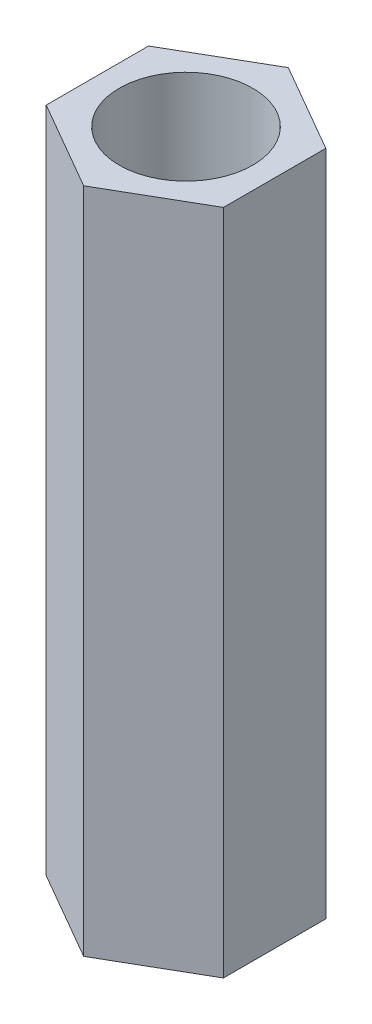
ISO-10303-21;
HEADER;
FILE_DESCRIPTION(('STEP AP214'),'2;1');
FILE_NAME('part.step','',(''),(''),'','','');
FILE_SCHEMA(('AUTOMOTIVE_DESIGN { 1 0 10303 214 1 1 1 1 }'));
ENDSEC;
DATA;
#1=APPLICATION_CONTEXT('core data for automotive mechanical design processes');
#2=APPLICATION_PROTOCOL_DEFINITION('international standard','automotive_design',2000,#1);
#3=PRODUCT_CONTEXT('',#1,'mechanical');
#4=PRODUCT('Part','Part','',(#3));
#5=PRODUCT_RELATED_PRODUCT_CATEGORY('part','',(#4));
#6=PRODUCT_DEFINITION_FORMATION('','',#4);
#7=PRODUCT_DEFINITION_CONTEXT('part definition',#1,'design');
#8=PRODUCT_DEFINITION('design','',#6,#7);
#9=PRODUCT_DEFINITION_SHAPE('','',#8);
#10=(LENGTH_UNIT() NAMED_UNIT(*) SI_UNIT(.MILLI.,.METRE.));
#11=(NAMED_UNIT(*) PLANE_ANGLE_UNIT() SI_UNIT($,.RADIAN.));
#12=(NAMED_UNIT(*) SI_UNIT($,.STERADIAN.) SOLID_ANGLE_UNIT());
#13=UNCERTAINTY_MEASURE_WITH_UNIT(LENGTH_MEASURE(1.E-05),#10,'distance_accuracy_value','');
#14=(GEOMETRIC_REPRESENTATION_CONTEXT(3) GLOBAL_UNCERTAINTY_ASSIGNED_CONTEXT((#13)) GLOBAL_UNIT_ASSIGNED_CONTEXT((#10,
#11,#12)) REPRESENTATION_CONTEXT('',''));
#15=CARTESIAN_POINT('',(0.,0.,0.));
#16=DIRECTION('',(0.,0.,1.));
#17=DIRECTION('',(1.,0.,0.));
#18=AXIS2_PLACEMENT_3D('',#15,#16,#17);
#19=CARTESIAN_POINT('',(0.,15.,0.));
#20=DIRECTION('',(0.,1.,0.));
#21=DIRECTION('',(0.,0.,1.));
#22=AXIS2_PLACEMENT_3D('',#19,#20,#21);
#23=PLANE('',#22);
#24=DIRECTION('',(0.,0.,-1.));
#25=VECTOR('',#24,1.);
#26=CARTESIAN_POINT('',(1.99185842870421,15.,1.14999999999999));
#27=LINE('',#26,#25);
#28=CARTESIAN_POINT('',(1.99185842870421,15.,1.14999999999999));
#29=VERTEX_POINT('',#28);
#30=CARTESIAN_POINT('',(1.9918584287042,15.,-1.15000000000001));
#31=VERTEX_POINT('',#30);
#32=EDGE_CURVE('E137',#29,#31,#27,.T.);
#33=ORIENTED_EDGE('',*,*,#32,.T.);
#34=DIRECTION('',(-0.866025403784441,0.,-0.499999999999995));
#35=VECTOR('',#34,1.);
#36=CARTESIAN_POINT('',(1.9918584287042,15.,-1.15000000000001));
#37=LINE('',#36,#35);
#38=CARTESIAN_POINT('',(0.,15.,-2.3));
#39=VERTEX_POINT('',#38);
#40=EDGE_CURVE('E95',#31,#39,#37,.T.);
#41=ORIENTED_EDGE('',*,*,#40,.T.);
#42=DIRECTION('',(-0.866025403784436,0.,0.500000000000004));
#43=VECTOR('',#42,1.);
#44=CARTESIAN_POINT('',(0.,15.,-2.3));
#45=LINE('',#44,#43);
#46=CARTESIAN_POINT('',(-1.99185842870422,15.,-1.14999999999999));
#47=VERTEX_POINT('',#46);
#48=EDGE_CURVE('E108',#39,#47,#45,.T.);
#49=ORIENTED_EDGE('',*,*,#48,.T.);
#50=DIRECTION('',(0.,0.,1.));
#51=VECTOR('',#50,1.);
#52=CARTESIAN_POINT('',(-1.99185842870422,15.,-1.14999999999999));
#53=LINE('',#52,#51);
#54=CARTESIAN_POINT('',(-1.9918584287042,15.,1.15000000000001));
#55=VERTEX_POINT('',#54);
#56=EDGE_CURVE('E102',#47,#55,#53,.T.);
#57=ORIENTED_EDGE('',*,*,#56,.T.);
#58=DIRECTION('',(0.866025403784441,0.,0.499999999999995));
#59=VECTOR('',#58,1.);
#60=CARTESIAN_POINT('',(-1.9918584287042,15.,1.15000000000001));
#61=LINE('',#60,#59);
#62=CARTESIAN_POINT('',(0.,15.,2.3));
#63=VERTEX_POINT('',#62);
#64=EDGE_CURVE('E106',#55,#63,#61,.T.);
#65=ORIENTED_EDGE('',*,*,#64,.T.);
#66=DIRECTION('',(0.866025403784436,0.,-0.500000000000004));
#67=VECTOR('',#66,1.);
#68=CARTESIAN_POINT('',(0.,15.,2.3));
#69=LINE('',#68,#67);
#70=EDGE_CURVE('E58',#63,#29,#69,.T.);
#71=ORIENTED_EDGE('',*,*,#70,.T.);
#72=EDGE_LOOP('',(#33,#41,#49,#57,#65,#71));
#73=FACE_BOUND('',#72,.T.);
#74=CARTESIAN_POINT('',(0.,15.,0.));
#75=DIRECTION('',(0.,1.,0.));
#76=DIRECTION('',(0.,0.,1.));
#77=AXIS2_PLACEMENT_3D('',#74,#75,#76);
#78=CIRCLE('',#77,1.5);
#79=CARTESIAN_POINT('',(0.,15.,1.5));
#80=VERTEX_POINT('',#79);
#81=EDGE_CURVE('E130',#80,#80,#78,.T.);
#82=ORIENTED_EDGE('',*,*,#81,.F.);
#83=EDGE_LOOP('',(#82));
#84=FACE_BOUND('',#83,.T.);
#85=ADVANCED_FACE('F41',(#73,#84),#23,.T.);
#86=CARTESIAN_POINT('',(0.,0.,0.));
#87=DIRECTION('',(0.,1.,0.));
#88=DIRECTION('',(0.,0.,1.));
#89=AXIS2_PLACEMENT_3D('',#86,#87,#88);
#90=PLANE('',#89);
#91=DIRECTION('',(0.,0.,-1.));
#92=VECTOR('',#91,1.);
#93=CARTESIAN_POINT('',(1.99185842870421,0.,1.14999999999999));
#94=LINE('',#93,#92);
#95=CARTESIAN_POINT('',(1.99185842870421,0.,1.14999999999999));
#96=VERTEX_POINT('',#95);
#97=CARTESIAN_POINT('',(1.9918584287042,0.,-1.15000000000001));
#98=VERTEX_POINT('',#97);
#99=EDGE_CURVE('E126',#96,#98,#94,.T.);
#100=ORIENTED_EDGE('',*,*,#99,.F.);
#101=DIRECTION('',(0.866025403784436,0.,-0.500000000000004));
#102=VECTOR('',#101,1.);
#103=CARTESIAN_POINT('',(0.,0.,2.3));
#104=LINE('',#103,#102);
#105=CARTESIAN_POINT('',(0.,0.,2.3));
#106=VERTEX_POINT('',#105);
#107=EDGE_CURVE('E87',#106,#96,#104,.T.);
#108=ORIENTED_EDGE('',*,*,#107,.F.);
#109=DIRECTION('',(0.866025403784441,0.,0.499999999999995));
#110=VECTOR('',#109,1.);
#111=CARTESIAN_POINT('',(-1.9918584287042,0.,1.15000000000001));
#112=LINE('',#111,#110);
#113=CARTESIAN_POINT('',(-1.9918584287042,0.,1.15000000000001));
#114=VERTEX_POINT('',#113);
#115=EDGE_CURVE('E81',#114,#106,#112,.T.);
#116=ORIENTED_EDGE('',*,*,#115,.F.);
#117=DIRECTION('',(0.,0.,1.));
#118=VECTOR('',#117,1.);
#119=CARTESIAN_POINT('',(-1.99185842870422,0.,-1.14999999999999));
#120=LINE('',#119,#118);
#121=CARTESIAN_POINT('',(-1.99185842870422,0.,-1.14999999999999));
#122=VERTEX_POINT('',#121);
#123=EDGE_CURVE('E116',#122,#114,#120,.T.);
#124=ORIENTED_EDGE('',*,*,#123,.F.);
#125=DIRECTION('',(-0.866025403784436,0.,0.500000000000004));
#126=VECTOR('',#125,1.);
#127=CARTESIAN_POINT('',(0.,0.,-2.3));
#128=LINE('',#127,#126);
#129=CARTESIAN_POINT('',(0.,0.,-2.3));
#130=VERTEX_POINT('',#129);
#131=EDGE_CURVE('E132',#130,#122,#128,.T.);
#132=ORIENTED_EDGE('',*,*,#131,.F.);
#133=DIRECTION('',(-0.866025403784441,0.,-0.499999999999995));
#134=VECTOR('',#133,1.);
#135=CARTESIAN_POINT('',(1.9918584287042,0.,-1.15000000000001));
#136=LINE('',#135,#134);
#137=EDGE_CURVE('E129',#98,#130,#136,.T.);
#138=ORIENTED_EDGE('',*,*,#137,.F.);
#139=EDGE_LOOP('',(#100,#108,#116,#124,#132,#138));
#140=FACE_BOUND('',#139,.T.);
#141=CARTESIAN_POINT('',(0.,0.,0.));
#142=DIRECTION('',(0.,1.,0.));
#143=DIRECTION('',(0.,0.,1.));
#144=AXIS2_PLACEMENT_3D('',#141,#142,#143);
#145=CIRCLE('',#144,1.5);
#146=CARTESIAN_POINT('',(0.,0.,1.5));
#147=VERTEX_POINT('',#146);
#148=EDGE_CURVE('E230',#147,#147,#145,.T.);
#149=ORIENTED_EDGE('',*,*,#148,.T.);
#150=EDGE_LOOP('',(#149));
#151=FACE_BOUND('',#150,.T.);
#152=ADVANCED_FACE('F146',(#140,#151),#90,.F.);
#153=CARTESIAN_POINT('',(1.99185842870421,15.,1.14999999999999));
#154=DIRECTION('',(-1.,0.,0.));
#155=DIRECTION('',(0.,0.,1.));
#156=AXIS2_PLACEMENT_3D('',#153,#154,#155);
#157=PLANE('',#156);
#158=ORIENTED_EDGE('',*,*,#99,.T.);
#159=DIRECTION('',(0.,-1.,0.));
#160=VECTOR('',#159,1.);
#161=CARTESIAN_POINT('',(1.9918584287042,15.,-1.15000000000001));
#162=LINE('',#161,#160);
#163=EDGE_CURVE('E11',#31,#98,#162,.T.);
#164=ORIENTED_EDGE('',*,*,#163,.F.);
#165=ORIENTED_EDGE('',*,*,#32,.F.);
#166=DIRECTION('',(0.,-1.,0.));
#167=VECTOR('',#166,1.);
#168=CARTESIAN_POINT('',(1.99185842870421,15.,1.14999999999999));
#169=LINE('',#168,#167);
#170=EDGE_CURVE('E122',#29,#96,#169,.T.);
#171=ORIENTED_EDGE('',*,*,#170,.T.);
#172=EDGE_LOOP('',(#158,#164,#165,#171));
#173=FACE_BOUND('',#172,.T.);
#174=ADVANCED_FACE('F43',(#173),#157,.F.);
#175=CARTESIAN_POINT('',(1.9918584287042,15.,-1.15000000000001));
#176=DIRECTION('',(-0.499999999999995,0.,0.866025403784441));
#177=DIRECTION('',(0.866025403784441,0.,0.499999999999995));
#178=AXIS2_PLACEMENT_3D('',#175,#176,#177);
#179=PLANE('',#178);
#180=ORIENTED_EDGE('',*,*,#137,.T.);
#181=DIRECTION('',(0.,-1.,0.));
#182=VECTOR('',#181,1.);
#183=CARTESIAN_POINT('',(0.,15.,-2.3));
#184=LINE('',#183,#182);
#185=EDGE_CURVE('E50',#39,#130,#184,.T.);
#186=ORIENTED_EDGE('',*,*,#185,.F.);
#187=ORIENTED_EDGE('',*,*,#40,.F.);
#188=ORIENTED_EDGE('',*,*,#163,.T.);
#189=EDGE_LOOP('',(#180,#186,#187,#188));
#190=FACE_BOUND('',#189,.T.);
#191=ADVANCED_FACE('F171',(#190),#179,.F.);
#192=CARTESIAN_POINT('',(0.,15.,-2.3));
#193=DIRECTION('',(0.500000000000004,0.,0.866025403784436));
#194=DIRECTION('',(0.866025403784436,0.,-0.500000000000004));
#195=AXIS2_PLACEMENT_3D('',#192,#193,#194);
#196=PLANE('',#195);
#197=ORIENTED_EDGE('',*,*,#131,.T.);
#198=DIRECTION('',(0.,-1.,0.));
#199=VECTOR('',#198,1.);
#200=CARTESIAN_POINT('',(-1.99185842870422,15.,-1.14999999999999));
#201=LINE('',#200,#199);
#202=EDGE_CURVE('E117',#47,#122,#201,.T.);
#203=ORIENTED_EDGE('',*,*,#202,.F.);
#204=ORIENTED_EDGE('',*,*,#48,.F.);
#205=ORIENTED_EDGE('',*,*,#185,.T.);
#206=EDGE_LOOP('',(#197,#203,#204,#205));
#207=FACE_BOUND('',#206,.T.);
#208=ADVANCED_FACE('F143',(#207),#196,.F.);
#209=CARTESIAN_POINT('',(-1.99185842870422,15.,-1.14999999999999));
#210=DIRECTION('',(1.,0.,0.));
#211=DIRECTION('',(0.,0.,-1.));
#212=AXIS2_PLACEMENT_3D('',#209,#210,#211);
#213=PLANE('',#212);
#214=ORIENTED_EDGE('',*,*,#123,.T.);
#215=DIRECTION('',(0.,-1.,0.));
#216=VECTOR('',#215,1.);
#217=CARTESIAN_POINT('',(-1.9918584287042,15.,1.15000000000001));
#218=LINE('',#217,#216);
#219=EDGE_CURVE('E113',#55,#114,#218,.T.);
#220=ORIENTED_EDGE('',*,*,#219,.F.);
#221=ORIENTED_EDGE('',*,*,#56,.F.);
#222=ORIENTED_EDGE('',*,*,#202,.T.);
#223=EDGE_LOOP('',(#214,#220,#221,#222));
#224=FACE_BOUND('',#223,.T.);
#225=ADVANCED_FACE('F114',(#224),#213,.F.);
#226=CARTESIAN_POINT('',(-1.9918584287042,15.,1.15000000000001));
#227=DIRECTION('',(0.499999999999995,0.,-0.866025403784441));
#228=DIRECTION('',(-0.866025403784441,0.,-0.499999999999995));
#229=AXIS2_PLACEMENT_3D('',#226,#227,#228);
#230=PLANE('',#229);
#231=ORIENTED_EDGE('',*,*,#115,.T.);
#232=DIRECTION('',(0.,-1.,0.));
#233=VECTOR('',#232,1.);
#234=CARTESIAN_POINT('',(0.,15.,2.3));
#235=LINE('',#234,#233);
#236=EDGE_CURVE('E118',#63,#106,#235,.T.);
#237=ORIENTED_EDGE('',*,*,#236,.F.);
#238=ORIENTED_EDGE('',*,*,#64,.F.);
#239=ORIENTED_EDGE('',*,*,#219,.T.);
#240=EDGE_LOOP('',(#231,#237,#238,#239));
#241=FACE_BOUND('',#240,.T.);
#242=ADVANCED_FACE('F120',(#241),#230,.F.);
#243=CARTESIAN_POINT('',(0.,15.,2.3));
#244=DIRECTION('',(-0.500000000000004,0.,-0.866025403784436));
#245=DIRECTION('',(-0.866025403784437,0.,0.500000000000004));
#246=AXIS2_PLACEMENT_3D('',#243,#244,#245);
#247=PLANE('',#246);
#248=ORIENTED_EDGE('',*,*,#107,.T.);
#249=ORIENTED_EDGE('',*,*,#170,.F.);
#250=ORIENTED_EDGE('',*,*,#70,.F.);
#251=ORIENTED_EDGE('',*,*,#236,.T.);
#252=EDGE_LOOP('',(#248,#249,#250,#251));
#253=FACE_BOUND('',#252,.T.);
#254=ADVANCED_FACE('F151',(#253),#247,.F.);
#255=CARTESIAN_POINT('',(0.,15.,0.));
#256=DIRECTION('',(0.,-1.,0.));
#257=DIRECTION('',(0.,0.,-1.));
#258=AXIS2_PLACEMENT_3D('',#255,#256,#257);
#259=CYLINDRICAL_SURFACE('',#258,1.5);
#260=ORIENTED_EDGE('',*,*,#81,.T.);
#261=EDGE_LOOP('',(#260));
#262=FACE_BOUND('',#261,.T.);
#263=ORIENTED_EDGE('',*,*,#148,.F.);
#264=EDGE_LOOP('',(#263));
#265=FACE_BOUND('',#264,.T.);
#266=ADVANCED_FACE('F153',(#262,#265),#259,.F.);
#267=CLOSED_SHELL('',(#85,#152,#174,#191,#208,#225,#242,#254,#266));
#268=MANIFOLD_SOLID_BREP('B2',#267);
#269=ADVANCED_BREP_SHAPE_REPRESENTATION('',(#18,#268),#14);
#270=SHAPE_DEFINITION_REPRESENTATION(#9,#269);
ENDSEC;
END-ISO-10303-21;
